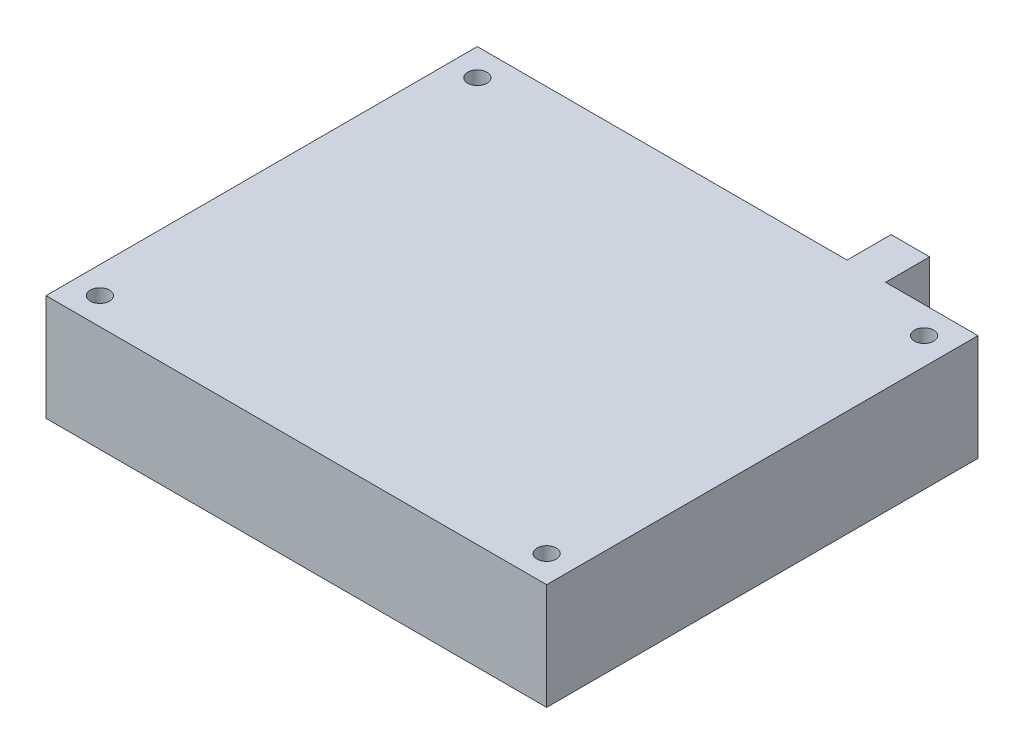
ISO-10303-21;
HEADER;
FILE_DESCRIPTION(('STEP AP214'),'2;1');
FILE_NAME('part.step','',(''),(''),'','','');
FILE_SCHEMA(('AUTOMOTIVE_DESIGN { 1 0 10303 214 1 1 1 1 }'));
ENDSEC;
DATA;
#1=APPLICATION_CONTEXT('core data for automotive mechanical design processes');
#2=APPLICATION_PROTOCOL_DEFINITION('international standard','automotive_design',2000,#1);
#3=PRODUCT_CONTEXT('',#1,'mechanical');
#4=PRODUCT('Part','Part','',(#3));
#5=PRODUCT_RELATED_PRODUCT_CATEGORY('part','',(#4));
#6=PRODUCT_DEFINITION_FORMATION('','',#4);
#7=PRODUCT_DEFINITION_CONTEXT('part definition',#1,'design');
#8=PRODUCT_DEFINITION('design','',#6,#7);
#9=PRODUCT_DEFINITION_SHAPE('','',#8);
#10=(LENGTH_UNIT() NAMED_UNIT(*) SI_UNIT(.MILLI.,.METRE.));
#11=(NAMED_UNIT(*) PLANE_ANGLE_UNIT() SI_UNIT($,.RADIAN.));
#12=(NAMED_UNIT(*) SI_UNIT($,.STERADIAN.) SOLID_ANGLE_UNIT());
#13=UNCERTAINTY_MEASURE_WITH_UNIT(LENGTH_MEASURE(1.E-05),#10,'distance_accuracy_value','');
#14=(GEOMETRIC_REPRESENTATION_CONTEXT(3) GLOBAL_UNCERTAINTY_ASSIGNED_CONTEXT((#13)) GLOBAL_UNIT_ASSIGNED_CONTEXT((#10,
#11,#12)) REPRESENTATION_CONTEXT('',''));
#15=CARTESIAN_POINT('',(0.,0.,0.));
#16=DIRECTION('',(0.,0.,1.));
#17=DIRECTION('',(1.,0.,0.));
#18=AXIS2_PLACEMENT_3D('',#15,#16,#17);
#19=CARTESIAN_POINT('',(0.,13.8,0.));
#20=DIRECTION('',(0.,-1.,0.));
#21=DIRECTION('',(0.,0.,-1.));
#22=AXIS2_PLACEMENT_3D('',#19,#20,#21);
#23=PLANE('',#22);
#24=DIRECTION('',(0.,0.,1.));
#25=VECTOR('',#24,1.);
#26=CARTESIAN_POINT('',(-32.5,13.8,28.));
#27=LINE('',#26,#25);
#28=CARTESIAN_POINT('',(-32.5,13.8,-28.));
#29=VERTEX_POINT('',#28);
#30=CARTESIAN_POINT('',(-32.5,13.8,28.));
#31=VERTEX_POINT('',#30);
#32=EDGE_CURVE('E154',#29,#31,#27,.T.);
#33=ORIENTED_EDGE('',*,*,#32,.T.);
#34=DIRECTION('',(1.,0.,0.));
#35=VECTOR('',#34,1.);
#36=CARTESIAN_POINT('',(32.5,13.8,28.));
#37=LINE('',#36,#35);
#38=CARTESIAN_POINT('',(32.5,13.8,28.));
#39=VERTEX_POINT('',#38);
#40=EDGE_CURVE('E103',#31,#39,#37,.T.);
#41=ORIENTED_EDGE('',*,*,#40,.T.);
#42=DIRECTION('',(0.,0.,-1.));
#43=VECTOR('',#42,1.);
#44=CARTESIAN_POINT('',(32.5,13.8,-28.));
#45=LINE('',#44,#43);
#46=CARTESIAN_POINT('',(32.5,13.8,-28.));
#47=VERTEX_POINT('',#46);
#48=EDGE_CURVE('E168',#39,#47,#45,.T.);
#49=ORIENTED_EDGE('',*,*,#48,.T.);
#50=DIRECTION('',(-1.,0.,0.));
#51=VECTOR('',#50,1.);
#52=CARTESIAN_POINT('',(20.5,13.8,-28.));
#53=LINE('',#52,#51);
#54=CARTESIAN_POINT('',(20.5,13.8,-28.));
#55=VERTEX_POINT('',#54);
#56=EDGE_CURVE('E181',#47,#55,#53,.T.);
#57=ORIENTED_EDGE('',*,*,#56,.T.);
#58=DIRECTION('',(0.,0.,-1.));
#59=VECTOR('',#58,1.);
#60=CARTESIAN_POINT('',(20.5,13.8,-33.72));
#61=LINE('',#60,#59);
#62=CARTESIAN_POINT('',(20.5,13.8,-33.72));
#63=VERTEX_POINT('',#62);
#64=EDGE_CURVE('E125',#55,#63,#61,.T.);
#65=ORIENTED_EDGE('',*,*,#64,.T.);
#66=DIRECTION('',(-1.,0.,0.));
#67=VECTOR('',#66,1.);
#68=CARTESIAN_POINT('',(15.5,13.8,-33.72));
#69=LINE('',#68,#67);
#70=CARTESIAN_POINT('',(15.5,13.8,-33.72));
#71=VERTEX_POINT('',#70);
#72=EDGE_CURVE('E116',#63,#71,#69,.T.);
#73=ORIENTED_EDGE('',*,*,#72,.T.);
#74=DIRECTION('',(0.,0.,1.));
#75=VECTOR('',#74,1.);
#76=CARTESIAN_POINT('',(15.5,13.8,-28.));
#77=LINE('',#76,#75);
#78=CARTESIAN_POINT('',(15.5,13.8,-28.));
#79=VERTEX_POINT('',#78);
#80=EDGE_CURVE('E119',#71,#79,#77,.T.);
#81=ORIENTED_EDGE('',*,*,#80,.T.);
#82=DIRECTION('',(-1.,0.,0.));
#83=VECTOR('',#82,1.);
#84=CARTESIAN_POINT('',(-32.5,13.8,-28.));
#85=LINE('',#84,#83);
#86=EDGE_CURVE('E58',#79,#29,#85,.T.);
#87=ORIENTED_EDGE('',*,*,#86,.T.);
#88=EDGE_LOOP('',(#33,#41,#49,#57,#65,#73,#81,#87));
#89=FACE_BOUND('',#88,.T.);
#90=CARTESIAN_POINT('',(-29.,13.8,-24.5));
#91=DIRECTION('',(0.,1.,0.));
#92=DIRECTION('',(0.,0.,1.));
#93=AXIS2_PLACEMENT_3D('',#90,#91,#92);
#94=CIRCLE('',#93,1.25);
#95=CARTESIAN_POINT('',(-29.,13.8,-23.25));
#96=VERTEX_POINT('',#95);
#97=EDGE_CURVE('E145',#96,#96,#94,.T.);
#98=ORIENTED_EDGE('',*,*,#97,.F.);
#99=EDGE_LOOP('',(#98));
#100=FACE_BOUND('',#99,.T.);
#101=CARTESIAN_POINT('',(-29.,13.8,24.5));
#102=DIRECTION('',(0.,1.,0.));
#103=DIRECTION('',(0.,0.,1.));
#104=AXIS2_PLACEMENT_3D('',#101,#102,#103);
#105=CIRCLE('',#104,1.25);
#106=CARTESIAN_POINT('',(-29.,13.8,25.75));
#107=VERTEX_POINT('',#106);
#108=EDGE_CURVE('E195',#107,#107,#105,.T.);
#109=ORIENTED_EDGE('',*,*,#108,.F.);
#110=EDGE_LOOP('',(#109));
#111=FACE_BOUND('',#110,.T.);
#112=CARTESIAN_POINT('',(29.,13.8,-24.5));
#113=DIRECTION('',(0.,1.,0.));
#114=DIRECTION('',(0.,0.,1.));
#115=AXIS2_PLACEMENT_3D('',#112,#113,#114);
#116=CIRCLE('',#115,1.25);
#117=CARTESIAN_POINT('',(29.,13.8,-23.25));
#118=VERTEX_POINT('',#117);
#119=EDGE_CURVE('E196',#118,#118,#116,.T.);
#120=ORIENTED_EDGE('',*,*,#119,.F.);
#121=EDGE_LOOP('',(#120));
#122=FACE_BOUND('',#121,.T.);
#123=CARTESIAN_POINT('',(29.,13.8,24.5));
#124=DIRECTION('',(0.,1.,0.));
#125=DIRECTION('',(0.,0.,1.));
#126=AXIS2_PLACEMENT_3D('',#123,#124,#125);
#127=CIRCLE('',#126,1.25);
#128=CARTESIAN_POINT('',(29.,13.8,25.75));
#129=VERTEX_POINT('',#128);
#130=EDGE_CURVE('E204',#129,#129,#127,.T.);
#131=ORIENTED_EDGE('',*,*,#130,.F.);
#132=EDGE_LOOP('',(#131));
#133=FACE_BOUND('',#132,.T.);
#134=ADVANCED_FACE('F43',(#89,#100,#111,#122,#133),#23,.F.);
#135=CARTESIAN_POINT('',(0.,0.,0.));
#136=DIRECTION('',(0.,-1.,0.));
#137=DIRECTION('',(0.,0.,-1.));
#138=AXIS2_PLACEMENT_3D('',#135,#136,#137);
#139=PLANE('',#138);
#140=CARTESIAN_POINT('',(29.,0.,-24.5));
#141=DIRECTION('',(0.,1.,0.));
#142=DIRECTION('',(0.,0.,1.));
#143=AXIS2_PLACEMENT_3D('',#140,#141,#142);
#144=CIRCLE('',#143,1.25);
#145=CARTESIAN_POINT('',(29.,0.,-23.25));
#146=VERTEX_POINT('',#145);
#147=EDGE_CURVE('E203',#146,#146,#144,.T.);
#148=ORIENTED_EDGE('',*,*,#147,.T.);
#149=EDGE_LOOP('',(#148));
#150=FACE_BOUND('',#149,.T.);
#151=CARTESIAN_POINT('',(-29.,0.,-24.5));
#152=DIRECTION('',(0.,1.,0.));
#153=DIRECTION('',(0.,0.,1.));
#154=AXIS2_PLACEMENT_3D('',#151,#152,#153);
#155=CIRCLE('',#154,1.25);
#156=CARTESIAN_POINT('',(-29.,0.,-23.25));
#157=VERTEX_POINT('',#156);
#158=EDGE_CURVE('E188',#157,#157,#155,.T.);
#159=ORIENTED_EDGE('',*,*,#158,.T.);
#160=EDGE_LOOP('',(#159));
#161=FACE_BOUND('',#160,.T.);
#162=DIRECTION('',(0.,0.,1.));
#163=VECTOR('',#162,1.);
#164=CARTESIAN_POINT('',(-32.5,0.,28.));
#165=LINE('',#164,#163);
#166=CARTESIAN_POINT('',(-32.5,0.,-28.));
#167=VERTEX_POINT('',#166);
#168=CARTESIAN_POINT('',(-32.5,0.,28.));
#169=VERTEX_POINT('',#168);
#170=EDGE_CURVE('E136',#167,#169,#165,.T.);
#171=ORIENTED_EDGE('',*,*,#170,.F.);
#172=DIRECTION('',(-1.,0.,0.));
#173=VECTOR('',#172,1.);
#174=CARTESIAN_POINT('',(-32.5,0.,-28.));
#175=LINE('',#174,#173);
#176=CARTESIAN_POINT('',(15.5,0.,-28.));
#177=VERTEX_POINT('',#176);
#178=EDGE_CURVE('E92',#177,#167,#175,.T.);
#179=ORIENTED_EDGE('',*,*,#178,.F.);
#180=DIRECTION('',(0.,0.,1.));
#181=VECTOR('',#180,1.);
#182=CARTESIAN_POINT('',(15.5,0.,-28.));
#183=LINE('',#182,#181);
#184=CARTESIAN_POINT('',(15.5,0.,-33.72));
#185=VERTEX_POINT('',#184);
#186=EDGE_CURVE('E90',#185,#177,#183,.T.);
#187=ORIENTED_EDGE('',*,*,#186,.F.);
#188=DIRECTION('',(-1.,0.,0.));
#189=VECTOR('',#188,1.);
#190=CARTESIAN_POINT('',(15.5,0.,-33.72));
#191=LINE('',#190,#189);
#192=CARTESIAN_POINT('',(20.5,0.,-33.72));
#193=VERTEX_POINT('',#192);
#194=EDGE_CURVE('E128',#193,#185,#191,.T.);
#195=ORIENTED_EDGE('',*,*,#194,.F.);
#196=DIRECTION('',(0.,0.,-1.));
#197=VECTOR('',#196,1.);
#198=CARTESIAN_POINT('',(20.5,0.,-33.72));
#199=LINE('',#198,#197);
#200=CARTESIAN_POINT('',(20.5,0.,-28.));
#201=VERTEX_POINT('',#200);
#202=EDGE_CURVE('E147',#201,#193,#199,.T.);
#203=ORIENTED_EDGE('',*,*,#202,.F.);
#204=DIRECTION('',(-1.,0.,0.));
#205=VECTOR('',#204,1.);
#206=CARTESIAN_POINT('',(20.5,0.,-28.));
#207=LINE('',#206,#205);
#208=CARTESIAN_POINT('',(32.5,0.,-28.));
#209=VERTEX_POINT('',#208);
#210=EDGE_CURVE('E146',#209,#201,#207,.T.);
#211=ORIENTED_EDGE('',*,*,#210,.F.);
#212=DIRECTION('',(0.,0.,-1.));
#213=VECTOR('',#212,1.);
#214=CARTESIAN_POINT('',(32.5,0.,-28.));
#215=LINE('',#214,#213);
#216=CARTESIAN_POINT('',(32.5,0.,28.));
#217=VERTEX_POINT('',#216);
#218=EDGE_CURVE('E148',#217,#209,#215,.T.);
#219=ORIENTED_EDGE('',*,*,#218,.F.);
#220=DIRECTION('',(1.,0.,0.));
#221=VECTOR('',#220,1.);
#222=CARTESIAN_POINT('',(32.5,0.,28.));
#223=LINE('',#222,#221);
#224=EDGE_CURVE('E141',#169,#217,#223,.T.);
#225=ORIENTED_EDGE('',*,*,#224,.F.);
#226=EDGE_LOOP('',(#171,#179,#187,#195,#203,#211,#219,#225));
#227=FACE_BOUND('',#226,.T.);
#228=CARTESIAN_POINT('',(-29.,0.,24.5));
#229=DIRECTION('',(0.,1.,0.));
#230=DIRECTION('',(0.,0.,1.));
#231=AXIS2_PLACEMENT_3D('',#228,#229,#230);
#232=CIRCLE('',#231,1.25);
#233=CARTESIAN_POINT('',(-29.,0.,25.75));
#234=VERTEX_POINT('',#233);
#235=EDGE_CURVE('E191',#234,#234,#232,.T.);
#236=ORIENTED_EDGE('',*,*,#235,.T.);
#237=EDGE_LOOP('',(#236));
#238=FACE_BOUND('',#237,.T.);
#239=CARTESIAN_POINT('',(29.,0.,24.5));
#240=DIRECTION('',(0.,1.,0.));
#241=DIRECTION('',(0.,0.,1.));
#242=AXIS2_PLACEMENT_3D('',#239,#240,#241);
#243=CIRCLE('',#242,1.25);
#244=CARTESIAN_POINT('',(29.,0.,25.75));
#245=VERTEX_POINT('',#244);
#246=EDGE_CURVE('E210',#245,#245,#243,.T.);
#247=ORIENTED_EDGE('',*,*,#246,.T.);
#248=EDGE_LOOP('',(#247));
#249=FACE_BOUND('',#248,.T.);
#250=ADVANCED_FACE('F173',(#150,#161,#227,#238,#249),#139,.T.);
#251=CARTESIAN_POINT('',(-32.5,13.8,28.));
#252=DIRECTION('',(1.,0.,0.));
#253=DIRECTION('',(0.,0.,-1.));
#254=AXIS2_PLACEMENT_3D('',#251,#252,#253);
#255=PLANE('',#254);
#256=ORIENTED_EDGE('',*,*,#170,.T.);
#257=DIRECTION('',(0.,-1.,0.));
#258=VECTOR('',#257,1.);
#259=CARTESIAN_POINT('',(-32.5,13.8,28.));
#260=LINE('',#259,#258);
#261=EDGE_CURVE('E11',#31,#169,#260,.T.);
#262=ORIENTED_EDGE('',*,*,#261,.F.);
#263=ORIENTED_EDGE('',*,*,#32,.F.);
#264=DIRECTION('',(0.,-1.,0.));
#265=VECTOR('',#264,1.);
#266=CARTESIAN_POINT('',(-32.5,13.8,-28.));
#267=LINE('',#266,#265);
#268=EDGE_CURVE('E137',#29,#167,#267,.T.);
#269=ORIENTED_EDGE('',*,*,#268,.T.);
#270=EDGE_LOOP('',(#256,#262,#263,#269));
#271=FACE_BOUND('',#270,.T.);
#272=ADVANCED_FACE('F44',(#271),#255,.F.);
#273=CARTESIAN_POINT('',(32.5,13.8,28.));
#274=DIRECTION('',(0.,0.,-1.));
#275=DIRECTION('',(-1.,0.,0.));
#276=AXIS2_PLACEMENT_3D('',#273,#274,#275);
#277=PLANE('',#276);
#278=ORIENTED_EDGE('',*,*,#224,.T.);
#279=DIRECTION('',(0.,-1.,0.));
#280=VECTOR('',#279,1.);
#281=CARTESIAN_POINT('',(32.5,13.8,28.));
#282=LINE('',#281,#280);
#283=EDGE_CURVE('E55',#39,#217,#282,.T.);
#284=ORIENTED_EDGE('',*,*,#283,.F.);
#285=ORIENTED_EDGE('',*,*,#40,.F.);
#286=ORIENTED_EDGE('',*,*,#261,.T.);
#287=EDGE_LOOP('',(#278,#284,#285,#286));
#288=FACE_BOUND('',#287,.T.);
#289=ADVANCED_FACE('F239',(#288),#277,.F.);
#290=CARTESIAN_POINT('',(32.5,13.8,-28.));
#291=DIRECTION('',(-1.,0.,0.));
#292=DIRECTION('',(0.,0.,1.));
#293=AXIS2_PLACEMENT_3D('',#290,#291,#292);
#294=PLANE('',#293);
#295=ORIENTED_EDGE('',*,*,#218,.T.);
#296=DIRECTION('',(0.,-1.,0.));
#297=VECTOR('',#296,1.);
#298=CARTESIAN_POINT('',(32.5,13.8,-28.));
#299=LINE('',#298,#297);
#300=EDGE_CURVE('E165',#47,#209,#299,.T.);
#301=ORIENTED_EDGE('',*,*,#300,.F.);
#302=ORIENTED_EDGE('',*,*,#48,.F.);
#303=ORIENTED_EDGE('',*,*,#283,.T.);
#304=EDGE_LOOP('',(#295,#301,#302,#303));
#305=FACE_BOUND('',#304,.T.);
#306=ADVANCED_FACE('F169',(#305),#294,.F.);
#307=CARTESIAN_POINT('',(20.5,13.8,-28.));
#308=DIRECTION('',(0.,0.,1.));
#309=DIRECTION('',(1.,0.,0.));
#310=AXIS2_PLACEMENT_3D('',#307,#308,#309);
#311=PLANE('',#310);
#312=ORIENTED_EDGE('',*,*,#210,.T.);
#313=DIRECTION('',(0.,-1.,0.));
#314=VECTOR('',#313,1.);
#315=CARTESIAN_POINT('',(20.5,13.8,-28.));
#316=LINE('',#315,#314);
#317=EDGE_CURVE('E157',#55,#201,#316,.T.);
#318=ORIENTED_EDGE('',*,*,#317,.F.);
#319=ORIENTED_EDGE('',*,*,#56,.F.);
#320=ORIENTED_EDGE('',*,*,#300,.T.);
#321=EDGE_LOOP('',(#312,#318,#319,#320));
#322=FACE_BOUND('',#321,.T.);
#323=ADVANCED_FACE('F179',(#322),#311,.F.);
#324=CARTESIAN_POINT('',(20.5,13.8,-33.72));
#325=DIRECTION('',(-1.,0.,0.));
#326=DIRECTION('',(0.,0.,1.));
#327=AXIS2_PLACEMENT_3D('',#324,#325,#326);
#328=PLANE('',#327);
#329=ORIENTED_EDGE('',*,*,#202,.T.);
#330=DIRECTION('',(0.,-1.,0.));
#331=VECTOR('',#330,1.);
#332=CARTESIAN_POINT('',(20.5,13.8,-33.72));
#333=LINE('',#332,#331);
#334=EDGE_CURVE('E131',#63,#193,#333,.T.);
#335=ORIENTED_EDGE('',*,*,#334,.F.);
#336=ORIENTED_EDGE('',*,*,#64,.F.);
#337=ORIENTED_EDGE('',*,*,#317,.T.);
#338=EDGE_LOOP('',(#329,#335,#336,#337));
#339=FACE_BOUND('',#338,.T.);
#340=ADVANCED_FACE('F185',(#339),#328,.F.);
#341=CARTESIAN_POINT('',(15.5,13.8,-33.72));
#342=DIRECTION('',(0.,0.,1.));
#343=DIRECTION('',(1.,0.,0.));
#344=AXIS2_PLACEMENT_3D('',#341,#342,#343);
#345=PLANE('',#344);
#346=ORIENTED_EDGE('',*,*,#194,.T.);
#347=DIRECTION('',(0.,-1.,0.));
#348=VECTOR('',#347,1.);
#349=CARTESIAN_POINT('',(15.5,13.8,-33.72));
#350=LINE('',#349,#348);
#351=EDGE_CURVE('E130',#71,#185,#350,.T.);
#352=ORIENTED_EDGE('',*,*,#351,.F.);
#353=ORIENTED_EDGE('',*,*,#72,.F.);
#354=ORIENTED_EDGE('',*,*,#334,.T.);
#355=EDGE_LOOP('',(#346,#352,#353,#354));
#356=FACE_BOUND('',#355,.T.);
#357=ADVANCED_FACE('F126',(#356),#345,.F.);
#358=CARTESIAN_POINT('',(15.5,13.8,-28.));
#359=DIRECTION('',(1.,0.,0.));
#360=DIRECTION('',(0.,0.,-1.));
#361=AXIS2_PLACEMENT_3D('',#358,#359,#360);
#362=PLANE('',#361);
#363=ORIENTED_EDGE('',*,*,#186,.T.);
#364=DIRECTION('',(0.,-1.,0.));
#365=VECTOR('',#364,1.);
#366=CARTESIAN_POINT('',(15.5,13.8,-28.));
#367=LINE('',#366,#365);
#368=EDGE_CURVE('E135',#79,#177,#367,.T.);
#369=ORIENTED_EDGE('',*,*,#368,.F.);
#370=ORIENTED_EDGE('',*,*,#80,.F.);
#371=ORIENTED_EDGE('',*,*,#351,.T.);
#372=EDGE_LOOP('',(#363,#369,#370,#371));
#373=FACE_BOUND('',#372,.T.);
#374=ADVANCED_FACE('F133',(#373),#362,.F.);
#375=CARTESIAN_POINT('',(-32.5,13.8,-28.));
#376=DIRECTION('',(0.,0.,1.));
#377=DIRECTION('',(1.,0.,0.));
#378=AXIS2_PLACEMENT_3D('',#375,#376,#377);
#379=PLANE('',#378);
#380=ORIENTED_EDGE('',*,*,#178,.T.);
#381=ORIENTED_EDGE('',*,*,#268,.F.);
#382=ORIENTED_EDGE('',*,*,#86,.F.);
#383=ORIENTED_EDGE('',*,*,#368,.T.);
#384=EDGE_LOOP('',(#380,#381,#382,#383));
#385=FACE_BOUND('',#384,.T.);
#386=ADVANCED_FACE('F230',(#385),#379,.F.);
#387=CARTESIAN_POINT('',(-29.,13.8,-24.5));
#388=DIRECTION('',(0.,-1.,0.));
#389=DIRECTION('',(0.,0.,-1.));
#390=AXIS2_PLACEMENT_3D('',#387,#388,#389);
#391=CYLINDRICAL_SURFACE('',#390,1.25);
#392=ORIENTED_EDGE('',*,*,#97,.T.);
#393=EDGE_LOOP('',(#392));
#394=FACE_BOUND('',#393,.T.);
#395=ORIENTED_EDGE('',*,*,#158,.F.);
#396=EDGE_LOOP('',(#395));
#397=FACE_BOUND('',#396,.T.);
#398=ADVANCED_FACE('F221',(#394,#397),#391,.F.);
#399=CARTESIAN_POINT('',(-29.,13.8,24.5));
#400=DIRECTION('',(0.,-1.,0.));
#401=DIRECTION('',(0.,0.,-1.));
#402=AXIS2_PLACEMENT_3D('',#399,#400,#401);
#403=CYLINDRICAL_SURFACE('',#402,1.25);
#404=ORIENTED_EDGE('',*,*,#108,.T.);
#405=EDGE_LOOP('',(#404));
#406=FACE_BOUND('',#405,.T.);
#407=ORIENTED_EDGE('',*,*,#235,.F.);
#408=EDGE_LOOP('',(#407));
#409=FACE_BOUND('',#408,.T.);
#410=ADVANCED_FACE('F305',(#406,#409),#403,.F.);
#411=CARTESIAN_POINT('',(29.,13.8,-24.5));
#412=DIRECTION('',(0.,-1.,0.));
#413=DIRECTION('',(0.,0.,-1.));
#414=AXIS2_PLACEMENT_3D('',#411,#412,#413);
#415=CYLINDRICAL_SURFACE('',#414,1.25);
#416=ORIENTED_EDGE('',*,*,#119,.T.);
#417=EDGE_LOOP('',(#416));
#418=FACE_BOUND('',#417,.T.);
#419=ORIENTED_EDGE('',*,*,#147,.F.);
#420=EDGE_LOOP('',(#419));
#421=FACE_BOUND('',#420,.T.);
#422=ADVANCED_FACE('F309',(#418,#421),#415,.F.);
#423=CARTESIAN_POINT('',(29.,13.8,24.5));
#424=DIRECTION('',(0.,-1.,0.));
#425=DIRECTION('',(0.,0.,-1.));
#426=AXIS2_PLACEMENT_3D('',#423,#424,#425);
#427=CYLINDRICAL_SURFACE('',#426,1.25);
#428=ORIENTED_EDGE('',*,*,#130,.T.);
#429=EDGE_LOOP('',(#428));
#430=FACE_BOUND('',#429,.T.);
#431=ORIENTED_EDGE('',*,*,#246,.F.);
#432=EDGE_LOOP('',(#431));
#433=FACE_BOUND('',#432,.T.);
#434=ADVANCED_FACE('F213',(#430,#433),#427,.F.);
#435=CLOSED_SHELL('',(#134,#250,#272,#289,#306,#323,#340,#357,#374,#386,#398,#410,#422,#434));
#436=MANIFOLD_SOLID_BREP('B2',#435);
#437=ADVANCED_BREP_SHAPE_REPRESENTATION('',(#18,#436),#14);
#438=SHAPE_DEFINITION_REPRESENTATION(#9,#437);
ENDSEC;
END-ISO-10303-21;
